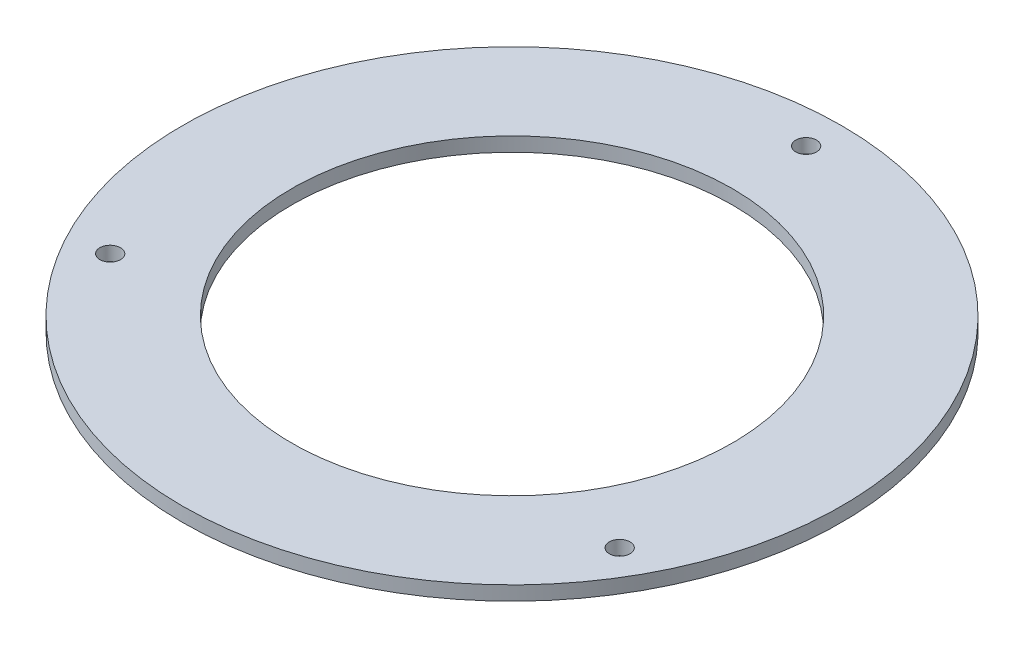
ISO-10303-21;
HEADER;
FILE_DESCRIPTION(('STEP AP214'),'2;1');
FILE_NAME('part.step','',(''),(''),'','','');
FILE_SCHEMA(('AUTOMOTIVE_DESIGN { 1 0 10303 214 1 1 1 1 }'));
ENDSEC;
DATA;
#1=APPLICATION_CONTEXT('core data for automotive mechanical design processes');
#2=APPLICATION_PROTOCOL_DEFINITION('international standard','automotive_design',2000,#1);
#3=PRODUCT_CONTEXT('',#1,'mechanical');
#4=PRODUCT('Part','Part','',(#3));
#5=PRODUCT_RELATED_PRODUCT_CATEGORY('part','',(#4));
#6=PRODUCT_DEFINITION_FORMATION('','',#4);
#7=PRODUCT_DEFINITION_CONTEXT('part definition',#1,'design');
#8=PRODUCT_DEFINITION('design','',#6,#7);
#9=PRODUCT_DEFINITION_SHAPE('','',#8);
#10=(LENGTH_UNIT() NAMED_UNIT(*) SI_UNIT(.MILLI.,.METRE.));
#11=(NAMED_UNIT(*) PLANE_ANGLE_UNIT() SI_UNIT($,.RADIAN.));
#12=(NAMED_UNIT(*) SI_UNIT($,.STERADIAN.) SOLID_ANGLE_UNIT());
#13=UNCERTAINTY_MEASURE_WITH_UNIT(LENGTH_MEASURE(1.E-05),#10,'distance_accuracy_value','');
#14=(GEOMETRIC_REPRESENTATION_CONTEXT(3) GLOBAL_UNCERTAINTY_ASSIGNED_CONTEXT((#13)) GLOBAL_UNIT_ASSIGNED_CONTEXT((#10,
#11,#12)) REPRESENTATION_CONTEXT('',''));
#15=CARTESIAN_POINT('',(0.,0.,0.));
#16=DIRECTION('',(0.,0.,1.));
#17=DIRECTION('',(1.,0.,0.));
#18=AXIS2_PLACEMENT_3D('',#15,#16,#17);
#19=CARTESIAN_POINT('',(0.,3.302,0.));
#20=DIRECTION('',(0.,-1.,0.));
#21=DIRECTION('',(0.,0.,-1.));
#22=AXIS2_PLACEMENT_3D('',#19,#20,#21);
#23=CYLINDRICAL_SURFACE('',#22,51.3842);
#24=CARTESIAN_POINT('',(0.,3.302,0.));
#25=DIRECTION('',(0.,1.,0.));
#26=DIRECTION('',(0.,0.,1.));
#27=AXIS2_PLACEMENT_3D('',#24,#25,#26);
#28=CIRCLE('',#27,51.3842);
#29=CARTESIAN_POINT('',(0.,3.302,-51.3842));
#30=VERTEX_POINT('',#29);
#31=EDGE_CURVE('E48',#30,#30,#28,.T.);
#32=CARTESIAN_POINT('',(0.,0.,0.));
#33=DIRECTION('',(0.,1.,0.));
#34=DIRECTION('',(0.,0.,1.));
#35=AXIS2_PLACEMENT_3D('',#32,#33,#34);
#36=CIRCLE('',#35,51.3842);
#37=CARTESIAN_POINT('',(0.,0.,-51.3842));
#38=VERTEX_POINT('',#37);
#39=EDGE_CURVE('E69',#38,#38,#36,.T.);
#40=CARTESIAN_POINT('',(0.,3.302,-51.3842));
#41=CARTESIAN_POINT('',(0.,3.26760416666667,-51.3842));
#42=CARTESIAN_POINT('',(0.,3.23320833333333,-51.3842));
#43=CARTESIAN_POINT('',(0.,3.16441666666667,-51.3842));
#44=CARTESIAN_POINT('',(0.,3.13002083333333,-51.3842));
#45=CARTESIAN_POINT('',(0.,3.06122916666667,-51.3842));
#46=CARTESIAN_POINT('',(0.,3.02683333333333,-51.3842));
#47=CARTESIAN_POINT('',(0.,2.95804166666667,-51.3842));
#48=CARTESIAN_POINT('',(0.,2.92364583333333,-51.3842));
#49=CARTESIAN_POINT('',(0.,2.85485416666667,-51.3842));
#50=CARTESIAN_POINT('',(0.,2.82045833333333,-51.3842));
#51=CARTESIAN_POINT('',(0.,2.75166666666667,-51.3842));
#52=CARTESIAN_POINT('',(0.,2.71727083333333,-51.3842));
#53=CARTESIAN_POINT('',(0.,2.64847916666667,-51.3842));
#54=CARTESIAN_POINT('',(0.,2.61408333333333,-51.3842));
#55=CARTESIAN_POINT('',(0.,2.54529166666667,-51.3842));
#56=CARTESIAN_POINT('',(0.,2.51089583333333,-51.3842));
#57=CARTESIAN_POINT('',(0.,2.44210416666667,-51.3842));
#58=CARTESIAN_POINT('',(0.,2.40770833333333,-51.3842));
#59=CARTESIAN_POINT('',(0.,2.33891666666667,-51.3842));
#60=CARTESIAN_POINT('',(0.,2.30452083333333,-51.3842));
#61=CARTESIAN_POINT('',(0.,2.23572916666667,-51.3842));
#62=CARTESIAN_POINT('',(0.,2.20133333333333,-51.3842));
#63=CARTESIAN_POINT('',(0.,2.13254166666667,-51.3842));
#64=CARTESIAN_POINT('',(0.,2.09814583333333,-51.3842));
#65=CARTESIAN_POINT('',(0.,2.02935416666667,-51.3842));
#66=CARTESIAN_POINT('',(0.,1.99495833333333,-51.3842));
#67=CARTESIAN_POINT('',(0.,1.92616666666667,-51.3842));
#68=CARTESIAN_POINT('',(0.,1.89177083333333,-51.3842));
#69=CARTESIAN_POINT('',(0.,1.82297916666667,-51.3842));
#70=CARTESIAN_POINT('',(0.,1.78858333333333,-51.3842));
#71=CARTESIAN_POINT('',(0.,1.71979166666667,-51.3842));
#72=CARTESIAN_POINT('',(0.,1.68539583333333,-51.3842));
#73=CARTESIAN_POINT('',(0.,1.61660416666667,-51.3842));
#74=CARTESIAN_POINT('',(0.,1.58220833333333,-51.3842));
#75=CARTESIAN_POINT('',(0.,1.51341666666667,-51.3842));
#76=CARTESIAN_POINT('',(0.,1.47902083333333,-51.3842));
#77=CARTESIAN_POINT('',(0.,1.41022916666667,-51.3842));
#78=CARTESIAN_POINT('',(0.,1.37583333333333,-51.3842));
#79=CARTESIAN_POINT('',(0.,1.30704166666667,-51.3842));
#80=CARTESIAN_POINT('',(0.,1.27264583333333,-51.3842));
#81=CARTESIAN_POINT('',(0.,1.20385416666667,-51.3842));
#82=CARTESIAN_POINT('',(0.,1.16945833333333,-51.3842));
#83=CARTESIAN_POINT('',(0.,1.10066666666667,-51.3842));
#84=CARTESIAN_POINT('',(0.,1.06627083333333,-51.3842));
#85=CARTESIAN_POINT('',(0.,0.997479166666666,-51.3842));
#86=CARTESIAN_POINT('',(0.,0.963083333333333,-51.3842));
#87=CARTESIAN_POINT('',(0.,0.894291666666666,-51.3842));
#88=CARTESIAN_POINT('',(0.,0.859895833333333,-51.3842));
#89=CARTESIAN_POINT('',(0.,0.791104166666666,-51.3842));
#90=CARTESIAN_POINT('',(0.,0.756708333333333,-51.3842));
#91=CARTESIAN_POINT('',(0.,0.687916666666667,-51.3842));
#92=CARTESIAN_POINT('',(0.,0.653520833333333,-51.3842));
#93=CARTESIAN_POINT('',(0.,0.584729166666667,-51.3842));
#94=CARTESIAN_POINT('',(0.,0.550333333333333,-51.3842));
#95=CARTESIAN_POINT('',(0.,0.481541666666667,-51.3842));
#96=CARTESIAN_POINT('',(0.,0.447145833333333,-51.3842));
#97=CARTESIAN_POINT('',(0.,0.378354166666667,-51.3842));
#98=CARTESIAN_POINT('',(0.,0.343958333333333,-51.3842));
#99=CARTESIAN_POINT('',(0.,0.275166666666667,-51.3842));
#100=CARTESIAN_POINT('',(0.,0.240770833333333,-51.3842));
#101=CARTESIAN_POINT('',(0.,0.171979166666667,-51.3842));
#102=CARTESIAN_POINT('',(0.,0.137583333333333,-51.3842));
#103=CARTESIAN_POINT('',(0.,0.0687916666666666,-51.3842));
#104=CARTESIAN_POINT('',(0.,0.0343958333333333,-51.3842));
#105=CARTESIAN_POINT('',(0.,0.,-51.3842));
#106=B_SPLINE_CURVE_WITH_KNOTS('',3,(#40,#41,#42,#43,#44,#45,#46,#47,#48,#49,#50,#51,#52,#53,
#54,#55,#56,#57,#58,#59,#60,#61,#62,#63,#64,#65,#66,#67,#68,#69,#70,#71,#72,#73,#74,#75,#76,#77,
#78,#79,#80,#81,#82,#83,#84,#85,#86,#87,#88,#89,#90,#91,#92,#93,#94,#95,#96,#97,#98,#99,#100,
#101,#102,#103,#104,#105),.UNSPECIFIED.,.F.,.F.,(4,2,2,2,2,2,2,2,2,2,2,2,2,2,2,2,2,2,2,2,2,2,2,
2,2,2,2,2,2,2,2,2,4),(0.,0.1031875,0.206375,0.3095625,0.41275,0.5159375,0.619125,0.7223125,
0.8255,0.9286875,1.031875,1.1350625,1.23825,1.3414375,1.444625,1.5478125,1.651,1.7541875,
1.857375,1.9605625,2.06375,2.1669375,2.270125,2.3733125,2.4765,2.5796875,2.682875,2.7860625,
2.88925,2.9924375,3.095625,3.1988125,3.302),.UNSPECIFIED.);
#107=EDGE_CURVE('BSEAM39',#30,#38,#106,.T.);
#108=ORIENTED_EDGE('',*,*,#31,.T.);
#109=ORIENTED_EDGE('',*,*,#39,.F.);
#110=ORIENTED_EDGE('',*,*,#107,.T.);
#111=ORIENTED_EDGE('',*,*,#107,.F.);
#112=EDGE_LOOP('',(#108,#110,#109,#111));
#113=FACE_BOUND('',#112,.T.);
#114=ADVANCED_FACE('F39',(#113),#23,.F.);
#115=CARTESIAN_POINT('',(0.,3.302,-68.58));
#116=DIRECTION('',(0.,-1.,0.));
#117=DIRECTION('',(0.,0.,-1.));
#118=AXIS2_PLACEMENT_3D('',#115,#116,#117);
#119=CYLINDRICAL_SURFACE('',#118,2.413);
#120=CARTESIAN_POINT('',(0.,3.302,-68.58));
#121=DIRECTION('',(0.,1.,0.));
#122=DIRECTION('',(0.,0.,1.));
#123=AXIS2_PLACEMENT_3D('',#120,#121,#122);
#124=CIRCLE('',#123,2.413);
#125=CARTESIAN_POINT('',(0.,3.302,-70.993));
#126=VERTEX_POINT('',#125);
#127=EDGE_CURVE('E54',#126,#126,#124,.T.);
#128=CARTESIAN_POINT('',(0.,0.,-68.58));
#129=DIRECTION('',(0.,1.,0.));
#130=DIRECTION('',(0.,0.,1.));
#131=AXIS2_PLACEMENT_3D('',#128,#129,#130);
#132=CIRCLE('',#131,2.413);
#133=CARTESIAN_POINT('',(0.,0.,-70.993));
#134=VERTEX_POINT('',#133);
#135=EDGE_CURVE('E66',#134,#134,#132,.T.);
#136=CARTESIAN_POINT('',(0.,3.302,-70.993));
#137=CARTESIAN_POINT('',(0.,3.26760416666667,-70.993));
#138=CARTESIAN_POINT('',(0.,3.23320833333333,-70.993));
#139=CARTESIAN_POINT('',(0.,3.16441666666667,-70.993));
#140=CARTESIAN_POINT('',(0.,3.13002083333333,-70.993));
#141=CARTESIAN_POINT('',(0.,3.06122916666667,-70.993));
#142=CARTESIAN_POINT('',(0.,3.02683333333333,-70.993));
#143=CARTESIAN_POINT('',(0.,2.95804166666667,-70.993));
#144=CARTESIAN_POINT('',(0.,2.92364583333333,-70.993));
#145=CARTESIAN_POINT('',(0.,2.85485416666667,-70.993));
#146=CARTESIAN_POINT('',(0.,2.82045833333333,-70.993));
#147=CARTESIAN_POINT('',(0.,2.75166666666667,-70.993));
#148=CARTESIAN_POINT('',(0.,2.71727083333333,-70.993));
#149=CARTESIAN_POINT('',(0.,2.64847916666667,-70.993));
#150=CARTESIAN_POINT('',(0.,2.61408333333333,-70.993));
#151=CARTESIAN_POINT('',(0.,2.54529166666667,-70.993));
#152=CARTESIAN_POINT('',(0.,2.51089583333333,-70.993));
#153=CARTESIAN_POINT('',(0.,2.44210416666667,-70.993));
#154=CARTESIAN_POINT('',(0.,2.40770833333333,-70.993));
#155=CARTESIAN_POINT('',(0.,2.33891666666667,-70.993));
#156=CARTESIAN_POINT('',(0.,2.30452083333333,-70.993));
#157=CARTESIAN_POINT('',(0.,2.23572916666667,-70.993));
#158=CARTESIAN_POINT('',(0.,2.20133333333333,-70.993));
#159=CARTESIAN_POINT('',(0.,2.13254166666667,-70.993));
#160=CARTESIAN_POINT('',(0.,2.09814583333333,-70.993));
#161=CARTESIAN_POINT('',(0.,2.02935416666667,-70.993));
#162=CARTESIAN_POINT('',(0.,1.99495833333333,-70.993));
#163=CARTESIAN_POINT('',(0.,1.92616666666667,-70.993));
#164=CARTESIAN_POINT('',(0.,1.89177083333333,-70.993));
#165=CARTESIAN_POINT('',(0.,1.82297916666667,-70.993));
#166=CARTESIAN_POINT('',(0.,1.78858333333333,-70.993));
#167=CARTESIAN_POINT('',(0.,1.71979166666667,-70.993));
#168=CARTESIAN_POINT('',(0.,1.68539583333333,-70.993));
#169=CARTESIAN_POINT('',(0.,1.61660416666667,-70.993));
#170=CARTESIAN_POINT('',(0.,1.58220833333333,-70.993));
#171=CARTESIAN_POINT('',(0.,1.51341666666667,-70.993));
#172=CARTESIAN_POINT('',(0.,1.47902083333333,-70.993));
#173=CARTESIAN_POINT('',(0.,1.41022916666667,-70.993));
#174=CARTESIAN_POINT('',(0.,1.37583333333333,-70.993));
#175=CARTESIAN_POINT('',(0.,1.30704166666667,-70.993));
#176=CARTESIAN_POINT('',(0.,1.27264583333333,-70.993));
#177=CARTESIAN_POINT('',(0.,1.20385416666667,-70.993));
#178=CARTESIAN_POINT('',(0.,1.16945833333333,-70.993));
#179=CARTESIAN_POINT('',(0.,1.10066666666667,-70.993));
#180=CARTESIAN_POINT('',(0.,1.06627083333333,-70.993));
#181=CARTESIAN_POINT('',(0.,0.997479166666666,-70.993));
#182=CARTESIAN_POINT('',(0.,0.963083333333333,-70.993));
#183=CARTESIAN_POINT('',(0.,0.894291666666666,-70.993));
#184=CARTESIAN_POINT('',(0.,0.859895833333333,-70.993));
#185=CARTESIAN_POINT('',(0.,0.791104166666666,-70.993));
#186=CARTESIAN_POINT('',(0.,0.756708333333333,-70.993));
#187=CARTESIAN_POINT('',(0.,0.687916666666667,-70.993));
#188=CARTESIAN_POINT('',(0.,0.653520833333333,-70.993));
#189=CARTESIAN_POINT('',(0.,0.584729166666667,-70.993));
#190=CARTESIAN_POINT('',(0.,0.550333333333333,-70.993));
#191=CARTESIAN_POINT('',(0.,0.481541666666667,-70.993));
#192=CARTESIAN_POINT('',(0.,0.447145833333333,-70.993));
#193=CARTESIAN_POINT('',(0.,0.378354166666667,-70.993));
#194=CARTESIAN_POINT('',(0.,0.343958333333333,-70.993));
#195=CARTESIAN_POINT('',(0.,0.275166666666667,-70.993));
#196=CARTESIAN_POINT('',(0.,0.240770833333333,-70.993));
#197=CARTESIAN_POINT('',(0.,0.171979166666667,-70.993));
#198=CARTESIAN_POINT('',(0.,0.137583333333333,-70.993));
#199=CARTESIAN_POINT('',(0.,0.0687916666666666,-70.993));
#200=CARTESIAN_POINT('',(0.,0.0343958333333333,-70.993));
#201=CARTESIAN_POINT('',(0.,0.,-70.993));
#202=B_SPLINE_CURVE_WITH_KNOTS('',3,(#136,#137,#138,#139,#140,#141,#142,#143,#144,#145,#146,
#147,#148,#149,#150,#151,#152,#153,#154,#155,#156,#157,#158,#159,#160,#161,#162,#163,#164,#165,
#166,#167,#168,#169,#170,#171,#172,#173,#174,#175,#176,#177,#178,#179,#180,#181,#182,#183,#184,
#185,#186,#187,#188,#189,#190,#191,#192,#193,#194,#195,#196,#197,#198,#199,#200,#201),
.UNSPECIFIED.,.F.,.F.,(4,2,2,2,2,2,2,2,2,2,2,2,2,2,2,2,2,2,2,2,2,2,2,2,2,2,2,2,2,2,2,2,4),(0.,
0.1031875,0.206375,0.3095625,0.41275,0.5159375,0.619125,0.7223125,0.8255,0.9286875,1.031875,
1.1350625,1.23825,1.3414375,1.444625,1.5478125,1.651,1.7541875,1.857375,1.9605625,2.06375,
2.1669375,2.270125,2.3733125,2.4765,2.5796875,2.682875,2.7860625,2.88925,2.9924375,3.095625,
3.1988125,3.302),.UNSPECIFIED.);
#203=EDGE_CURVE('BSEAM92',#126,#134,#202,.T.);
#204=ORIENTED_EDGE('',*,*,#127,.T.);
#205=ORIENTED_EDGE('',*,*,#135,.F.);
#206=ORIENTED_EDGE('',*,*,#203,.T.);
#207=ORIENTED_EDGE('',*,*,#203,.F.);
#208=EDGE_LOOP('',(#204,#206,#205,#207));
#209=FACE_BOUND('',#208,.T.);
#210=ADVANCED_FACE('F92',(#209),#119,.F.);
#211=CARTESIAN_POINT('',(59.3920221915367,3.302,34.2900000000003));
#212=DIRECTION('',(0.,-1.,0.));
#213=DIRECTION('',(0.,0.,-1.));
#214=AXIS2_PLACEMENT_3D('',#211,#212,#213);
#215=CYLINDRICAL_SURFACE('',#214,2.41299999999999);
#216=CARTESIAN_POINT('',(59.3920221915367,3.302,34.2900000000003));
#217=DIRECTION('',(0.,1.,0.));
#218=DIRECTION('',(0.,0.,1.));
#219=AXIS2_PLACEMENT_3D('',#216,#217,#218);
#220=CIRCLE('',#219,2.41299999999999);
#221=CARTESIAN_POINT('',(59.3920221915367,3.302,31.8770000000003));
#222=VERTEX_POINT('',#221);
#223=EDGE_CURVE('E81',#222,#222,#220,.T.);
#224=CARTESIAN_POINT('',(59.3920221915367,0.,34.2900000000003));
#225=DIRECTION('',(0.,1.,0.));
#226=DIRECTION('',(0.,0.,1.));
#227=AXIS2_PLACEMENT_3D('',#224,#225,#226);
#228=CIRCLE('',#227,2.41299999999999);
#229=CARTESIAN_POINT('',(59.3920221915367,0.,31.8770000000003));
#230=VERTEX_POINT('',#229);
#231=EDGE_CURVE('E62',#230,#230,#228,.T.);
#232=CARTESIAN_POINT('',(59.3920221915367,3.302,31.8770000000003));
#233=CARTESIAN_POINT('',(59.3920221915367,3.26760416666667,31.8770000000003));
#234=CARTESIAN_POINT('',(59.3920221915367,3.23320833333333,31.8770000000003));
#235=CARTESIAN_POINT('',(59.3920221915367,3.16441666666667,31.8770000000003));
#236=CARTESIAN_POINT('',(59.3920221915367,3.13002083333333,31.8770000000003));
#237=CARTESIAN_POINT('',(59.3920221915367,3.06122916666667,31.8770000000003));
#238=CARTESIAN_POINT('',(59.3920221915367,3.02683333333333,31.8770000000003));
#239=CARTESIAN_POINT('',(59.3920221915367,2.95804166666667,31.8770000000003));
#240=CARTESIAN_POINT('',(59.3920221915367,2.92364583333333,31.8770000000003));
#241=CARTESIAN_POINT('',(59.3920221915367,2.85485416666667,31.8770000000003));
#242=CARTESIAN_POINT('',(59.3920221915367,2.82045833333333,31.8770000000003));
#243=CARTESIAN_POINT('',(59.3920221915367,2.75166666666667,31.8770000000003));
#244=CARTESIAN_POINT('',(59.3920221915367,2.71727083333333,31.8770000000003));
#245=CARTESIAN_POINT('',(59.3920221915367,2.64847916666667,31.8770000000003));
#246=CARTESIAN_POINT('',(59.3920221915367,2.61408333333333,31.8770000000003));
#247=CARTESIAN_POINT('',(59.3920221915367,2.54529166666667,31.8770000000003));
#248=CARTESIAN_POINT('',(59.3920221915367,2.51089583333333,31.8770000000003));
#249=CARTESIAN_POINT('',(59.3920221915367,2.44210416666667,31.8770000000003));
#250=CARTESIAN_POINT('',(59.3920221915367,2.40770833333333,31.8770000000003));
#251=CARTESIAN_POINT('',(59.3920221915367,2.33891666666667,31.8770000000003));
#252=CARTESIAN_POINT('',(59.3920221915367,2.30452083333333,31.8770000000003));
#253=CARTESIAN_POINT('',(59.3920221915367,2.23572916666667,31.8770000000003));
#254=CARTESIAN_POINT('',(59.3920221915367,2.20133333333333,31.8770000000003));
#255=CARTESIAN_POINT('',(59.3920221915367,2.13254166666667,31.8770000000003));
#256=CARTESIAN_POINT('',(59.3920221915367,2.09814583333333,31.8770000000003));
#257=CARTESIAN_POINT('',(59.3920221915367,2.02935416666667,31.8770000000003));
#258=CARTESIAN_POINT('',(59.3920221915367,1.99495833333333,31.8770000000003));
#259=CARTESIAN_POINT('',(59.3920221915367,1.92616666666667,31.8770000000003));
#260=CARTESIAN_POINT('',(59.3920221915367,1.89177083333333,31.8770000000003));
#261=CARTESIAN_POINT('',(59.3920221915367,1.82297916666667,31.8770000000003));
#262=CARTESIAN_POINT('',(59.3920221915367,1.78858333333333,31.8770000000003));
#263=CARTESIAN_POINT('',(59.3920221915367,1.71979166666667,31.8770000000003));
#264=CARTESIAN_POINT('',(59.3920221915367,1.68539583333333,31.8770000000003));
#265=CARTESIAN_POINT('',(59.3920221915367,1.61660416666667,31.8770000000003));
#266=CARTESIAN_POINT('',(59.3920221915367,1.58220833333333,31.8770000000003));
#267=CARTESIAN_POINT('',(59.3920221915367,1.51341666666667,31.8770000000003));
#268=CARTESIAN_POINT('',(59.3920221915367,1.47902083333333,31.8770000000003));
#269=CARTESIAN_POINT('',(59.3920221915367,1.41022916666667,31.8770000000003));
#270=CARTESIAN_POINT('',(59.3920221915367,1.37583333333333,31.8770000000003));
#271=CARTESIAN_POINT('',(59.3920221915367,1.30704166666667,31.8770000000003));
#272=CARTESIAN_POINT('',(59.3920221915367,1.27264583333333,31.8770000000003));
#273=CARTESIAN_POINT('',(59.3920221915367,1.20385416666667,31.8770000000003));
#274=CARTESIAN_POINT('',(59.3920221915367,1.16945833333333,31.8770000000003));
#275=CARTESIAN_POINT('',(59.3920221915367,1.10066666666667,31.8770000000003));
#276=CARTESIAN_POINT('',(59.3920221915367,1.06627083333333,31.8770000000003));
#277=CARTESIAN_POINT('',(59.3920221915367,0.997479166666666,31.8770000000003));
#278=CARTESIAN_POINT('',(59.3920221915367,0.963083333333333,31.8770000000003));
#279=CARTESIAN_POINT('',(59.3920221915367,0.894291666666666,31.8770000000003));
#280=CARTESIAN_POINT('',(59.3920221915367,0.859895833333333,31.8770000000003));
#281=CARTESIAN_POINT('',(59.3920221915367,0.791104166666666,31.8770000000003));
#282=CARTESIAN_POINT('',(59.3920221915367,0.756708333333333,31.8770000000003));
#283=CARTESIAN_POINT('',(59.3920221915367,0.687916666666667,31.8770000000003));
#284=CARTESIAN_POINT('',(59.3920221915367,0.653520833333333,31.8770000000003));
#285=CARTESIAN_POINT('',(59.3920221915367,0.584729166666667,31.8770000000003));
#286=CARTESIAN_POINT('',(59.3920221915367,0.550333333333333,31.8770000000003));
#287=CARTESIAN_POINT('',(59.3920221915367,0.481541666666667,31.8770000000003));
#288=CARTESIAN_POINT('',(59.3920221915367,0.447145833333333,31.8770000000003));
#289=CARTESIAN_POINT('',(59.3920221915367,0.378354166666667,31.8770000000003));
#290=CARTESIAN_POINT('',(59.3920221915367,0.343958333333333,31.8770000000003));
#291=CARTESIAN_POINT('',(59.3920221915367,0.275166666666667,31.8770000000003));
#292=CARTESIAN_POINT('',(59.3920221915367,0.240770833333333,31.8770000000003));
#293=CARTESIAN_POINT('',(59.3920221915367,0.171979166666667,31.8770000000003));
#294=CARTESIAN_POINT('',(59.3920221915367,0.137583333333333,31.8770000000003));
#295=CARTESIAN_POINT('',(59.3920221915367,0.0687916666666666,31.8770000000003));
#296=CARTESIAN_POINT('',(59.3920221915367,0.0343958333333333,31.8770000000003));
#297=CARTESIAN_POINT('',(59.3920221915367,0.,31.8770000000003));
#298=B_SPLINE_CURVE_WITH_KNOTS('',3,(#232,#233,#234,#235,#236,#237,#238,#239,#240,#241,#242,
#243,#244,#245,#246,#247,#248,#249,#250,#251,#252,#253,#254,#255,#256,#257,#258,#259,#260,#261,
#262,#263,#264,#265,#266,#267,#268,#269,#270,#271,#272,#273,#274,#275,#276,#277,#278,#279,#280,
#281,#282,#283,#284,#285,#286,#287,#288,#289,#290,#291,#292,#293,#294,#295,#296,#297),
.UNSPECIFIED.,.F.,.F.,(4,2,2,2,2,2,2,2,2,2,2,2,2,2,2,2,2,2,2,2,2,2,2,2,2,2,2,2,2,2,2,2,4),(0.,
0.1031875,0.206375,0.3095625,0.41275,0.5159375,0.619125,0.7223125,0.8255,0.9286875,1.031875,
1.1350625,1.23825,1.3414375,1.444625,1.5478125,1.651,1.7541875,1.857375,1.9605625,2.06375,
2.1669375,2.270125,2.3733125,2.4765,2.5796875,2.682875,2.7860625,2.88925,2.9924375,3.095625,
3.1988125,3.302),.UNSPECIFIED.);
#299=EDGE_CURVE('BSEAM110',#222,#230,#298,.T.);
#300=ORIENTED_EDGE('',*,*,#223,.T.);
#301=ORIENTED_EDGE('',*,*,#231,.F.);
#302=ORIENTED_EDGE('',*,*,#299,.T.);
#303=ORIENTED_EDGE('',*,*,#299,.F.);
#304=EDGE_LOOP('',(#300,#302,#301,#303));
#305=FACE_BOUND('',#304,.T.);
#306=ADVANCED_FACE('F110',(#305),#215,.F.);
#307=CARTESIAN_POINT('',(-59.3920221915371,3.302,34.2899999999994));
#308=DIRECTION('',(0.,-1.,0.));
#309=DIRECTION('',(0.,0.,-1.));
#310=AXIS2_PLACEMENT_3D('',#307,#308,#309);
#311=CYLINDRICAL_SURFACE('',#310,2.413);
#312=CARTESIAN_POINT('',(-59.3920221915371,3.302,34.2899999999994));
#313=DIRECTION('',(0.,1.,0.));
#314=DIRECTION('',(0.,0.,1.));
#315=AXIS2_PLACEMENT_3D('',#312,#313,#314);
#316=CIRCLE('',#315,2.413);
#317=CARTESIAN_POINT('',(-59.3920221915371,3.302,31.8769999999994));
#318=VERTEX_POINT('',#317);
#319=EDGE_CURVE('E76',#318,#318,#316,.T.);
#320=CARTESIAN_POINT('',(-59.3920221915371,0.,34.2899999999994));
#321=DIRECTION('',(0.,1.,0.));
#322=DIRECTION('',(0.,0.,1.));
#323=AXIS2_PLACEMENT_3D('',#320,#321,#322);
#324=CIRCLE('',#323,2.413);
#325=CARTESIAN_POINT('',(-59.3920221915371,0.,31.8769999999994));
#326=VERTEX_POINT('',#325);
#327=EDGE_CURVE('E58',#326,#326,#324,.T.);
#328=CARTESIAN_POINT('',(-59.3920221915371,3.302,31.8769999999994));
#329=CARTESIAN_POINT('',(-59.3920221915371,3.26760416666667,31.8769999999994));
#330=CARTESIAN_POINT('',(-59.3920221915371,3.23320833333333,31.8769999999994));
#331=CARTESIAN_POINT('',(-59.3920221915371,3.16441666666667,31.8769999999994));
#332=CARTESIAN_POINT('',(-59.3920221915371,3.13002083333333,31.8769999999994));
#333=CARTESIAN_POINT('',(-59.3920221915371,3.06122916666667,31.8769999999994));
#334=CARTESIAN_POINT('',(-59.3920221915371,3.02683333333333,31.8769999999994));
#335=CARTESIAN_POINT('',(-59.3920221915371,2.95804166666667,31.8769999999994));
#336=CARTESIAN_POINT('',(-59.3920221915371,2.92364583333333,31.8769999999994));
#337=CARTESIAN_POINT('',(-59.3920221915371,2.85485416666667,31.8769999999994));
#338=CARTESIAN_POINT('',(-59.3920221915371,2.82045833333333,31.8769999999994));
#339=CARTESIAN_POINT('',(-59.3920221915371,2.75166666666667,31.8769999999994));
#340=CARTESIAN_POINT('',(-59.3920221915371,2.71727083333333,31.8769999999994));
#341=CARTESIAN_POINT('',(-59.3920221915371,2.64847916666667,31.8769999999994));
#342=CARTESIAN_POINT('',(-59.3920221915371,2.61408333333333,31.8769999999994));
#343=CARTESIAN_POINT('',(-59.3920221915371,2.54529166666667,31.8769999999994));
#344=CARTESIAN_POINT('',(-59.3920221915371,2.51089583333333,31.8769999999994));
#345=CARTESIAN_POINT('',(-59.3920221915371,2.44210416666667,31.8769999999994));
#346=CARTESIAN_POINT('',(-59.3920221915371,2.40770833333333,31.8769999999994));
#347=CARTESIAN_POINT('',(-59.3920221915371,2.33891666666667,31.8769999999994));
#348=CARTESIAN_POINT('',(-59.3920221915371,2.30452083333333,31.8769999999994));
#349=CARTESIAN_POINT('',(-59.3920221915371,2.23572916666667,31.8769999999994));
#350=CARTESIAN_POINT('',(-59.3920221915371,2.20133333333333,31.8769999999994));
#351=CARTESIAN_POINT('',(-59.3920221915371,2.13254166666667,31.8769999999994));
#352=CARTESIAN_POINT('',(-59.3920221915371,2.09814583333333,31.8769999999994));
#353=CARTESIAN_POINT('',(-59.3920221915371,2.02935416666667,31.8769999999994));
#354=CARTESIAN_POINT('',(-59.3920221915371,1.99495833333333,31.8769999999994));
#355=CARTESIAN_POINT('',(-59.3920221915371,1.92616666666667,31.8769999999994));
#356=CARTESIAN_POINT('',(-59.3920221915371,1.89177083333333,31.8769999999994));
#357=CARTESIAN_POINT('',(-59.3920221915371,1.82297916666667,31.8769999999994));
#358=CARTESIAN_POINT('',(-59.3920221915371,1.78858333333333,31.8769999999994));
#359=CARTESIAN_POINT('',(-59.3920221915371,1.71979166666667,31.8769999999994));
#360=CARTESIAN_POINT('',(-59.3920221915371,1.68539583333333,31.8769999999994));
#361=CARTESIAN_POINT('',(-59.3920221915371,1.61660416666667,31.8769999999994));
#362=CARTESIAN_POINT('',(-59.3920221915371,1.58220833333333,31.8769999999994));
#363=CARTESIAN_POINT('',(-59.3920221915371,1.51341666666667,31.8769999999994));
#364=CARTESIAN_POINT('',(-59.3920221915371,1.47902083333333,31.8769999999994));
#365=CARTESIAN_POINT('',(-59.3920221915371,1.41022916666667,31.8769999999994));
#366=CARTESIAN_POINT('',(-59.3920221915371,1.37583333333333,31.8769999999994));
#367=CARTESIAN_POINT('',(-59.3920221915371,1.30704166666667,31.8769999999994));
#368=CARTESIAN_POINT('',(-59.3920221915371,1.27264583333333,31.8769999999994));
#369=CARTESIAN_POINT('',(-59.3920221915371,1.20385416666667,31.8769999999994));
#370=CARTESIAN_POINT('',(-59.3920221915371,1.16945833333333,31.8769999999994));
#371=CARTESIAN_POINT('',(-59.3920221915371,1.10066666666667,31.8769999999994));
#372=CARTESIAN_POINT('',(-59.3920221915371,1.06627083333333,31.8769999999994));
#373=CARTESIAN_POINT('',(-59.3920221915371,0.997479166666666,31.8769999999994));
#374=CARTESIAN_POINT('',(-59.3920221915371,0.963083333333333,31.8769999999994));
#375=CARTESIAN_POINT('',(-59.3920221915371,0.894291666666666,31.8769999999994));
#376=CARTESIAN_POINT('',(-59.3920221915371,0.859895833333333,31.8769999999994));
#377=CARTESIAN_POINT('',(-59.3920221915371,0.791104166666666,31.8769999999994));
#378=CARTESIAN_POINT('',(-59.3920221915371,0.756708333333333,31.8769999999994));
#379=CARTESIAN_POINT('',(-59.3920221915371,0.687916666666667,31.8769999999994));
#380=CARTESIAN_POINT('',(-59.3920221915371,0.653520833333333,31.8769999999994));
#381=CARTESIAN_POINT('',(-59.3920221915371,0.584729166666667,31.8769999999994));
#382=CARTESIAN_POINT('',(-59.3920221915371,0.550333333333333,31.8769999999994));
#383=CARTESIAN_POINT('',(-59.3920221915371,0.481541666666667,31.8769999999994));
#384=CARTESIAN_POINT('',(-59.3920221915371,0.447145833333333,31.8769999999994));
#385=CARTESIAN_POINT('',(-59.3920221915371,0.378354166666667,31.8769999999994));
#386=CARTESIAN_POINT('',(-59.3920221915371,0.343958333333333,31.8769999999994));
#387=CARTESIAN_POINT('',(-59.3920221915371,0.275166666666667,31.8769999999994));
#388=CARTESIAN_POINT('',(-59.3920221915371,0.240770833333333,31.8769999999994));
#389=CARTESIAN_POINT('',(-59.3920221915371,0.171979166666667,31.8769999999994));
#390=CARTESIAN_POINT('',(-59.3920221915371,0.137583333333333,31.8769999999994));
#391=CARTESIAN_POINT('',(-59.3920221915371,0.0687916666666666,31.8769999999994));
#392=CARTESIAN_POINT('',(-59.3920221915371,0.0343958333333333,31.8769999999994));
#393=CARTESIAN_POINT('',(-59.3920221915371,0.,31.8769999999994));
#394=B_SPLINE_CURVE_WITH_KNOTS('',3,(#328,#329,#330,#331,#332,#333,#334,#335,#336,#337,#338,
#339,#340,#341,#342,#343,#344,#345,#346,#347,#348,#349,#350,#351,#352,#353,#354,#355,#356,#357,
#358,#359,#360,#361,#362,#363,#364,#365,#366,#367,#368,#369,#370,#371,#372,#373,#374,#375,#376,
#377,#378,#379,#380,#381,#382,#383,#384,#385,#386,#387,#388,#389,#390,#391,#392,#393),
.UNSPECIFIED.,.F.,.F.,(4,2,2,2,2,2,2,2,2,2,2,2,2,2,2,2,2,2,2,2,2,2,2,2,2,2,2,2,2,2,2,2,4),(0.,
0.1031875,0.206375,0.3095625,0.41275,0.5159375,0.619125,0.7223125,0.8255,0.9286875,1.031875,
1.1350625,1.23825,1.3414375,1.444625,1.5478125,1.651,1.7541875,1.857375,1.9605625,2.06375,
2.1669375,2.270125,2.3733125,2.4765,2.5796875,2.682875,2.7860625,2.88925,2.9924375,3.095625,
3.1988125,3.302),.UNSPECIFIED.);
#395=EDGE_CURVE('BSEAM41',#318,#326,#394,.T.);
#396=ORIENTED_EDGE('',*,*,#319,.T.);
#397=ORIENTED_EDGE('',*,*,#327,.F.);
#398=ORIENTED_EDGE('',*,*,#395,.T.);
#399=ORIENTED_EDGE('',*,*,#395,.F.);
#400=EDGE_LOOP('',(#396,#398,#397,#399));
#401=FACE_BOUND('',#400,.T.);
#402=ADVANCED_FACE('F41',(#401),#311,.F.);
#403=CARTESIAN_POINT('',(0.,3.302,0.));
#404=DIRECTION('',(0.,-1.,0.));
#405=DIRECTION('',(0.,0.,-1.));
#406=AXIS2_PLACEMENT_3D('',#403,#404,#405);
#407=CYLINDRICAL_SURFACE('',#406,76.835);
#408=CARTESIAN_POINT('',(0.,3.302,0.));
#409=DIRECTION('',(0.,1.,0.));
#410=DIRECTION('',(0.,0.,1.));
#411=AXIS2_PLACEMENT_3D('',#408,#409,#410);
#412=CIRCLE('',#411,76.835);
#413=CARTESIAN_POINT('',(0.,3.302,-76.835));
#414=VERTEX_POINT('',#413);
#415=EDGE_CURVE('E10',#414,#414,#412,.T.);
#416=CARTESIAN_POINT('',(0.,0.,0.));
#417=DIRECTION('',(0.,1.,0.));
#418=DIRECTION('',(0.,0.,1.));
#419=AXIS2_PLACEMENT_3D('',#416,#417,#418);
#420=CIRCLE('',#419,76.835);
#421=CARTESIAN_POINT('',(0.,0.,-76.835));
#422=VERTEX_POINT('',#421);
#423=EDGE_CURVE('E43',#422,#422,#420,.T.);
#424=CARTESIAN_POINT('',(0.,3.302,-76.835));
#425=CARTESIAN_POINT('',(0.,3.26760416666667,-76.835));
#426=CARTESIAN_POINT('',(0.,3.23320833333333,-76.835));
#427=CARTESIAN_POINT('',(0.,3.16441666666667,-76.835));
#428=CARTESIAN_POINT('',(0.,3.13002083333333,-76.835));
#429=CARTESIAN_POINT('',(0.,3.06122916666667,-76.835));
#430=CARTESIAN_POINT('',(0.,3.02683333333333,-76.835));
#431=CARTESIAN_POINT('',(0.,2.95804166666667,-76.835));
#432=CARTESIAN_POINT('',(0.,2.92364583333333,-76.835));
#433=CARTESIAN_POINT('',(0.,2.85485416666667,-76.835));
#434=CARTESIAN_POINT('',(0.,2.82045833333333,-76.835));
#435=CARTESIAN_POINT('',(0.,2.75166666666667,-76.835));
#436=CARTESIAN_POINT('',(0.,2.71727083333333,-76.835));
#437=CARTESIAN_POINT('',(0.,2.64847916666667,-76.835));
#438=CARTESIAN_POINT('',(0.,2.61408333333333,-76.835));
#439=CARTESIAN_POINT('',(0.,2.54529166666667,-76.835));
#440=CARTESIAN_POINT('',(0.,2.51089583333333,-76.835));
#441=CARTESIAN_POINT('',(0.,2.44210416666667,-76.835));
#442=CARTESIAN_POINT('',(0.,2.40770833333333,-76.835));
#443=CARTESIAN_POINT('',(0.,2.33891666666667,-76.835));
#444=CARTESIAN_POINT('',(0.,2.30452083333333,-76.835));
#445=CARTESIAN_POINT('',(0.,2.23572916666667,-76.835));
#446=CARTESIAN_POINT('',(0.,2.20133333333333,-76.835));
#447=CARTESIAN_POINT('',(0.,2.13254166666667,-76.835));
#448=CARTESIAN_POINT('',(0.,2.09814583333333,-76.835));
#449=CARTESIAN_POINT('',(0.,2.02935416666667,-76.835));
#450=CARTESIAN_POINT('',(0.,1.99495833333333,-76.835));
#451=CARTESIAN_POINT('',(0.,1.92616666666667,-76.835));
#452=CARTESIAN_POINT('',(0.,1.89177083333333,-76.835));
#453=CARTESIAN_POINT('',(0.,1.82297916666667,-76.835));
#454=CARTESIAN_POINT('',(0.,1.78858333333333,-76.835));
#455=CARTESIAN_POINT('',(0.,1.71979166666667,-76.835));
#456=CARTESIAN_POINT('',(0.,1.68539583333333,-76.835));
#457=CARTESIAN_POINT('',(0.,1.61660416666667,-76.835));
#458=CARTESIAN_POINT('',(0.,1.58220833333333,-76.835));
#459=CARTESIAN_POINT('',(0.,1.51341666666667,-76.835));
#460=CARTESIAN_POINT('',(0.,1.47902083333333,-76.835));
#461=CARTESIAN_POINT('',(0.,1.41022916666667,-76.835));
#462=CARTESIAN_POINT('',(0.,1.37583333333333,-76.835));
#463=CARTESIAN_POINT('',(0.,1.30704166666667,-76.835));
#464=CARTESIAN_POINT('',(0.,1.27264583333333,-76.835));
#465=CARTESIAN_POINT('',(0.,1.20385416666667,-76.835));
#466=CARTESIAN_POINT('',(0.,1.16945833333333,-76.835));
#467=CARTESIAN_POINT('',(0.,1.10066666666667,-76.835));
#468=CARTESIAN_POINT('',(0.,1.06627083333333,-76.835));
#469=CARTESIAN_POINT('',(0.,0.997479166666667,-76.835));
#470=CARTESIAN_POINT('',(0.,0.963083333333334,-76.835));
#471=CARTESIAN_POINT('',(0.,0.894291666666667,-76.835));
#472=CARTESIAN_POINT('',(0.,0.859895833333333,-76.835));
#473=CARTESIAN_POINT('',(0.,0.791104166666666,-76.835));
#474=CARTESIAN_POINT('',(0.,0.756708333333333,-76.835));
#475=CARTESIAN_POINT('',(0.,0.687916666666667,-76.835));
#476=CARTESIAN_POINT('',(0.,0.653520833333333,-76.835));
#477=CARTESIAN_POINT('',(0.,0.584729166666667,-76.835));
#478=CARTESIAN_POINT('',(0.,0.550333333333333,-76.835));
#479=CARTESIAN_POINT('',(0.,0.481541666666667,-76.835));
#480=CARTESIAN_POINT('',(0.,0.447145833333333,-76.835));
#481=CARTESIAN_POINT('',(0.,0.378354166666667,-76.835));
#482=CARTESIAN_POINT('',(0.,0.343958333333333,-76.835));
#483=CARTESIAN_POINT('',(0.,0.275166666666667,-76.835));
#484=CARTESIAN_POINT('',(0.,0.240770833333333,-76.835));
#485=CARTESIAN_POINT('',(0.,0.171979166666667,-76.835));
#486=CARTESIAN_POINT('',(0.,0.137583333333333,-76.835));
#487=CARTESIAN_POINT('',(0.,0.0687916666666666,-76.835));
#488=CARTESIAN_POINT('',(0.,0.0343958333333333,-76.835));
#489=CARTESIAN_POINT('',(0.,0.,-76.835));
#490=B_SPLINE_CURVE_WITH_KNOTS('',3,(#424,#425,#426,#427,#428,#429,#430,#431,#432,#433,#434,
#435,#436,#437,#438,#439,#440,#441,#442,#443,#444,#445,#446,#447,#448,#449,#450,#451,#452,#453,
#454,#455,#456,#457,#458,#459,#460,#461,#462,#463,#464,#465,#466,#467,#468,#469,#470,#471,#472,
#473,#474,#475,#476,#477,#478,#479,#480,#481,#482,#483,#484,#485,#486,#487,#488,#489),
.UNSPECIFIED.,.F.,.F.,(4,2,2,2,2,2,2,2,2,2,2,2,2,2,2,2,2,2,2,2,2,2,2,2,2,2,2,2,2,2,2,2,4),(0.,
0.1031875,0.206375,0.3095625,0.41275,0.5159375,0.619125,0.7223125,0.8255,0.9286875,1.031875,
1.1350625,1.23825,1.3414375,1.444625,1.5478125,1.651,1.7541875,1.857375,1.9605625,2.06375,
2.1669375,2.270125,2.3733125,2.4765,2.5796875,2.682875,2.7860625,2.88925,2.9924375,3.095625,
3.1988125,3.302),.UNSPECIFIED.);
#491=EDGE_CURVE('BSEAM99',#414,#422,#490,.T.);
#492=ORIENTED_EDGE('',*,*,#415,.F.);
#493=ORIENTED_EDGE('',*,*,#423,.T.);
#494=ORIENTED_EDGE('',*,*,#491,.T.);
#495=ORIENTED_EDGE('',*,*,#491,.F.);
#496=EDGE_LOOP('',(#492,#494,#493,#495));
#497=FACE_BOUND('',#496,.T.);
#498=ADVANCED_FACE('F99',(#497),#407,.T.);
#499=CARTESIAN_POINT('',(0.,3.302,0.));
#500=DIRECTION('',(0.,1.,0.));
#501=DIRECTION('',(0.,0.,1.));
#502=AXIS2_PLACEMENT_3D('',#499,#500,#501);
#503=PLANE('',#502);
#504=ORIENTED_EDGE('',*,*,#319,.F.);
#505=EDGE_LOOP('',(#504));
#506=FACE_BOUND('',#505,.T.);
#507=ORIENTED_EDGE('',*,*,#223,.F.);
#508=EDGE_LOOP('',(#507));
#509=FACE_BOUND('',#508,.T.);
#510=ORIENTED_EDGE('',*,*,#127,.F.);
#511=EDGE_LOOP('',(#510));
#512=FACE_BOUND('',#511,.T.);
#513=ORIENTED_EDGE('',*,*,#31,.F.);
#514=EDGE_LOOP('',(#513));
#515=FACE_BOUND('',#514,.T.);
#516=ORIENTED_EDGE('',*,*,#415,.T.);
#517=EDGE_LOOP('',(#516));
#518=FACE_BOUND('',#517,.T.);
#519=ADVANCED_FACE('F95',(#506,#509,#512,#515,#518),#503,.T.);
#520=CARTESIAN_POINT('',(0.,0.,0.));
#521=DIRECTION('',(0.,1.,0.));
#522=DIRECTION('',(0.,0.,1.));
#523=AXIS2_PLACEMENT_3D('',#520,#521,#522);
#524=PLANE('',#523);
#525=ORIENTED_EDGE('',*,*,#327,.T.);
#526=EDGE_LOOP('',(#525));
#527=FACE_BOUND('',#526,.T.);
#528=ORIENTED_EDGE('',*,*,#231,.T.);
#529=EDGE_LOOP('',(#528));
#530=FACE_BOUND('',#529,.T.);
#531=ORIENTED_EDGE('',*,*,#135,.T.);
#532=EDGE_LOOP('',(#531));
#533=FACE_BOUND('',#532,.T.);
#534=ORIENTED_EDGE('',*,*,#39,.T.);
#535=EDGE_LOOP('',(#534));
#536=FACE_BOUND('',#535,.T.);
#537=ORIENTED_EDGE('',*,*,#423,.F.);
#538=EDGE_LOOP('',(#537));
#539=FACE_BOUND('',#538,.T.);
#540=ADVANCED_FACE('F98',(#527,#530,#533,#536,#539),#524,.F.);
#541=CLOSED_SHELL('',(#114,#210,#306,#402,#498,#519,#540));
#542=MANIFOLD_SOLID_BREP('B2',#541);
#543=ADVANCED_BREP_SHAPE_REPRESENTATION('',(#18,#542),#14);
#544=SHAPE_DEFINITION_REPRESENTATION(#9,#543);
ENDSEC;
END-ISO-10303-21;
